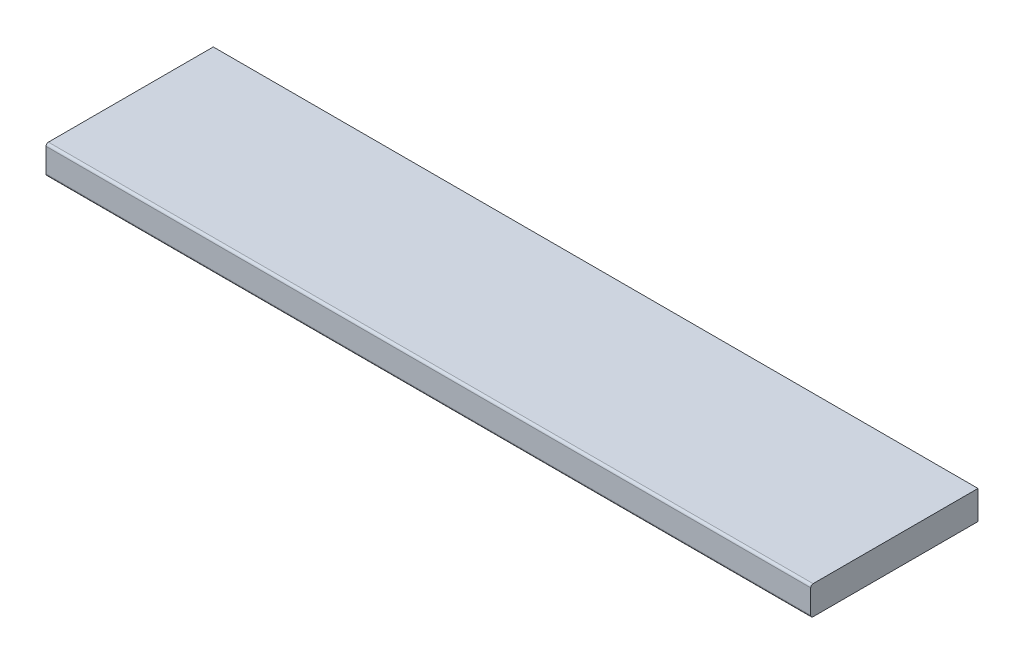
ISO-10303-21;
HEADER;
FILE_DESCRIPTION(('STEP AP214'),'2;1');
FILE_NAME('part.step','',(''),(''),'','','');
FILE_SCHEMA(('AUTOMOTIVE_DESIGN { 1 0 10303 214 1 1 1 1 }'));
ENDSEC;
DATA;
#1=APPLICATION_CONTEXT('core data for automotive mechanical design processes');
#2=APPLICATION_PROTOCOL_DEFINITION('international standard','automotive_design',2000,#1);
#3=PRODUCT_CONTEXT('',#1,'mechanical');
#4=PRODUCT('Part','Part','',(#3));
#5=PRODUCT_RELATED_PRODUCT_CATEGORY('part','',(#4));
#6=PRODUCT_DEFINITION_FORMATION('','',#4);
#7=PRODUCT_DEFINITION_CONTEXT('part definition',#1,'design');
#8=PRODUCT_DEFINITION('design','',#6,#7);
#9=PRODUCT_DEFINITION_SHAPE('','',#8);
#10=(LENGTH_UNIT() NAMED_UNIT(*) SI_UNIT(.MILLI.,.METRE.));
#11=(NAMED_UNIT(*) PLANE_ANGLE_UNIT() SI_UNIT($,.RADIAN.));
#12=(NAMED_UNIT(*) SI_UNIT($,.STERADIAN.) SOLID_ANGLE_UNIT());
#13=UNCERTAINTY_MEASURE_WITH_UNIT(LENGTH_MEASURE(1.E-05),#10,'distance_accuracy_value','');
#14=(GEOMETRIC_REPRESENTATION_CONTEXT(3) GLOBAL_UNCERTAINTY_ASSIGNED_CONTEXT((#13)) GLOBAL_UNIT_ASSIGNED_CONTEXT((#10,
#11,#12)) REPRESENTATION_CONTEXT('',''));
#15=CARTESIAN_POINT('',(0.,0.,0.));
#16=DIRECTION('',(0.,0.,1.));
#17=DIRECTION('',(1.,0.,0.));
#18=AXIS2_PLACEMENT_3D('',#15,#16,#17);
#19=CARTESIAN_POINT('',(-198.947368421053,28.7368421052632,350.));
#20=DIRECTION('',(1.,0.,0.));
#21=DIRECTION('',(0.,0.,-1.));
#22=AXIS2_PLACEMENT_3D('',#19,#20,#21);
#23=PLANE('',#22);
#24=DIRECTION('',(0.,0.,-1.));
#25=VECTOR('',#24,1.);
#26=CARTESIAN_POINT('',(-198.947368421053,-31.2631578947368,350.));
#27=LINE('',#26,#25);
#28=CARTESIAN_POINT('',(-198.947368421053,-31.2631578947368,345.));
#29=VERTEX_POINT('',#28);
#30=CARTESIAN_POINT('',(-198.947368421053,-31.2631578947368,0.));
#31=VERTEX_POINT('',#30);
#32=EDGE_CURVE('E84',#29,#31,#27,.T.);
#33=ORIENTED_EDGE('',*,*,#32,.F.);
#34=CARTESIAN_POINT('',(-198.947368421053,-26.2631578947368,345.));
#35=DIRECTION('',(1.,0.,0.));
#36=DIRECTION('',(0.,0.,-1.));
#37=AXIS2_PLACEMENT_3D('',#34,#35,#36);
#38=CIRCLE('',#37,5.);
#39=CARTESIAN_POINT('',(-198.947368421053,-26.2631578947368,350.));
#40=VERTEX_POINT('',#39);
#41=EDGE_CURVE('E41',#29,#40,#38,.F.);
#42=ORIENTED_EDGE('',*,*,#41,.T.);
#43=DIRECTION('',(0.,-1.,0.));
#44=VECTOR('',#43,1.);
#45=CARTESIAN_POINT('',(-198.947368421053,28.7368421052632,350.));
#46=LINE('',#45,#44);
#47=CARTESIAN_POINT('',(-198.947368421053,23.7368421052632,350.));
#48=VERTEX_POINT('',#47);
#49=EDGE_CURVE('E112',#48,#40,#46,.T.);
#50=ORIENTED_EDGE('',*,*,#49,.F.);
#51=CARTESIAN_POINT('',(-198.947368421053,23.7368421052632,345.));
#52=DIRECTION('',(1.,0.,0.));
#53=DIRECTION('',(0.,0.,-1.));
#54=AXIS2_PLACEMENT_3D('',#51,#52,#53);
#55=CIRCLE('',#54,5.);
#56=CARTESIAN_POINT('',(-198.947368421053,28.7368421052632,345.));
#57=VERTEX_POINT('',#56);
#58=EDGE_CURVE('E48',#48,#57,#55,.F.);
#59=ORIENTED_EDGE('',*,*,#58,.T.);
#60=DIRECTION('',(0.,0.,-1.));
#61=VECTOR('',#60,1.);
#62=CARTESIAN_POINT('',(-198.947368421053,28.7368421052632,350.));
#63=LINE('',#62,#61);
#64=CARTESIAN_POINT('',(-198.947368421053,28.7368421052632,0.));
#65=VERTEX_POINT('',#64);
#66=EDGE_CURVE('E102',#57,#65,#63,.T.);
#67=ORIENTED_EDGE('',*,*,#66,.T.);
#68=DIRECTION('',(0.,-1.,0.));
#69=VECTOR('',#68,1.);
#70=CARTESIAN_POINT('',(-198.947368421053,28.7368421052632,0.));
#71=LINE('',#70,#69);
#72=EDGE_CURVE('E98',#65,#31,#71,.T.);
#73=ORIENTED_EDGE('',*,*,#72,.T.);
#74=EDGE_LOOP('',(#33,#42,#50,#59,#67,#73));
#75=FACE_BOUND('',#74,.T.);
#76=ADVANCED_FACE('F33',(#75),#23,.F.);
#77=CARTESIAN_POINT('',(-198.947368421053,-31.2631578947368,350.));
#78=DIRECTION('',(0.,1.,0.));
#79=DIRECTION('',(0.,0.,1.));
#80=AXIS2_PLACEMENT_3D('',#77,#78,#79);
#81=PLANE('',#80);
#82=DIRECTION('',(0.,0.,-1.));
#83=VECTOR('',#82,1.);
#84=CARTESIAN_POINT('',(1401.05263157895,-31.2631578947368,350.));
#85=LINE('',#84,#83);
#86=CARTESIAN_POINT('',(1401.05263157895,-31.2631578947368,345.));
#87=VERTEX_POINT('',#86);
#88=CARTESIAN_POINT('',(1401.05263157895,-31.2631578947368,0.));
#89=VERTEX_POINT('',#88);
#90=EDGE_CURVE('E92',#87,#89,#85,.T.);
#91=ORIENTED_EDGE('',*,*,#90,.F.);
#92=DIRECTION('',(1.,0.,0.));
#93=VECTOR('',#92,1.);
#94=CARTESIAN_POINT('',(-198.947368421053,-31.2631578947368,345.));
#95=LINE('',#94,#93);
#96=EDGE_CURVE('E56',#87,#29,#95,.F.);
#97=ORIENTED_EDGE('',*,*,#96,.T.);
#98=ORIENTED_EDGE('',*,*,#32,.T.);
#99=DIRECTION('',(1.,0.,0.));
#100=VECTOR('',#99,1.);
#101=CARTESIAN_POINT('',(-198.947368421053,-31.2631578947368,0.));
#102=LINE('',#101,#100);
#103=EDGE_CURVE('E87',#31,#89,#102,.T.);
#104=ORIENTED_EDGE('',*,*,#103,.T.);
#105=EDGE_LOOP('',(#91,#97,#98,#104));
#106=FACE_BOUND('',#105,.T.);
#107=ADVANCED_FACE('F86',(#106),#81,.F.);
#108=CARTESIAN_POINT('',(1401.05263157895,28.7368421052632,350.));
#109=DIRECTION('',(-1.,0.,0.));
#110=DIRECTION('',(0.,0.,1.));
#111=AXIS2_PLACEMENT_3D('',#108,#109,#110);
#112=PLANE('',#111);
#113=DIRECTION('',(0.,1.,0.));
#114=VECTOR('',#113,1.);
#115=CARTESIAN_POINT('',(1401.05263157895,28.7368421052632,350.));
#116=LINE('',#115,#114);
#117=CARTESIAN_POINT('',(1401.05263157895,-26.2631578947368,350.));
#118=VERTEX_POINT('',#117);
#119=CARTESIAN_POINT('',(1401.05263157895,23.7368421052632,350.));
#120=VERTEX_POINT('',#119);
#121=EDGE_CURVE('E106',#118,#120,#116,.T.);
#122=ORIENTED_EDGE('',*,*,#121,.F.);
#123=CARTESIAN_POINT('',(1401.05263157895,-26.2631578947368,345.));
#124=DIRECTION('',(-1.,0.,0.));
#125=DIRECTION('',(0.,0.,1.));
#126=AXIS2_PLACEMENT_3D('',#123,#124,#125);
#127=CIRCLE('',#126,5.);
#128=EDGE_CURVE('E124',#118,#87,#127,.F.);
#129=ORIENTED_EDGE('',*,*,#128,.T.);
#130=ORIENTED_EDGE('',*,*,#90,.T.);
#131=DIRECTION('',(0.,1.,0.));
#132=VECTOR('',#131,1.);
#133=CARTESIAN_POINT('',(1401.05263157895,28.7368421052632,0.));
#134=LINE('',#133,#132);
#135=CARTESIAN_POINT('',(1401.05263157895,28.7368421052632,0.));
#136=VERTEX_POINT('',#135);
#137=EDGE_CURVE('E100',#89,#136,#134,.T.);
#138=ORIENTED_EDGE('',*,*,#137,.T.);
#139=DIRECTION('',(0.,0.,-1.));
#140=VECTOR('',#139,1.);
#141=CARTESIAN_POINT('',(1401.05263157895,28.7368421052632,350.));
#142=LINE('',#141,#140);
#143=CARTESIAN_POINT('',(1401.05263157895,28.7368421052632,345.));
#144=VERTEX_POINT('',#143);
#145=EDGE_CURVE('E114',#144,#136,#142,.T.);
#146=ORIENTED_EDGE('',*,*,#145,.F.);
#147=CARTESIAN_POINT('',(1401.05263157895,23.7368421052632,345.));
#148=DIRECTION('',(-1.,0.,0.));
#149=DIRECTION('',(0.,0.,1.));
#150=AXIS2_PLACEMENT_3D('',#147,#148,#149);
#151=CIRCLE('',#150,5.);
#152=EDGE_CURVE('E122',#144,#120,#151,.F.);
#153=ORIENTED_EDGE('',*,*,#152,.T.);
#154=EDGE_LOOP('',(#122,#129,#130,#138,#146,#153));
#155=FACE_BOUND('',#154,.T.);
#156=ADVANCED_FACE('F137',(#155),#112,.F.);
#157=CARTESIAN_POINT('',(-198.947368421053,28.7368421052632,350.));
#158=DIRECTION('',(0.,-1.,0.));
#159=DIRECTION('',(1.,0.,0.));
#160=AXIS2_PLACEMENT_3D('',#157,#158,#159);
#161=PLANE('',#160);
#162=ORIENTED_EDGE('',*,*,#66,.F.);
#163=DIRECTION('',(-1.,0.,0.));
#164=VECTOR('',#163,1.);
#165=CARTESIAN_POINT('',(1401.05263157895,28.7368421052632,345.));
#166=LINE('',#165,#164);
#167=EDGE_CURVE('E11',#57,#144,#166,.F.);
#168=ORIENTED_EDGE('',*,*,#167,.T.);
#169=ORIENTED_EDGE('',*,*,#145,.T.);
#170=DIRECTION('',(-1.,0.,0.));
#171=VECTOR('',#170,1.);
#172=CARTESIAN_POINT('',(-198.947368421053,28.7368421052632,0.));
#173=LINE('',#172,#171);
#174=EDGE_CURVE('E110',#136,#65,#173,.T.);
#175=ORIENTED_EDGE('',*,*,#174,.T.);
#176=EDGE_LOOP('',(#162,#168,#169,#175));
#177=FACE_BOUND('',#176,.T.);
#178=ADVANCED_FACE('F143',(#177),#161,.F.);
#179=CARTESIAN_POINT('',(0.,0.,350.));
#180=DIRECTION('',(0.,0.,1.));
#181=DIRECTION('',(1.,0.,0.));
#182=AXIS2_PLACEMENT_3D('',#179,#180,#181);
#183=PLANE('',#182);
#184=ORIENTED_EDGE('',*,*,#49,.T.);
#185=DIRECTION('',(1.,0.,0.));
#186=VECTOR('',#185,1.);
#187=CARTESIAN_POINT('',(1401.05263157895,-26.2631578947368,350.));
#188=LINE('',#187,#186);
#189=EDGE_CURVE('E119',#40,#118,#188,.T.);
#190=ORIENTED_EDGE('',*,*,#189,.T.);
#191=ORIENTED_EDGE('',*,*,#121,.T.);
#192=DIRECTION('',(-1.,0.,0.));
#193=VECTOR('',#192,1.);
#194=CARTESIAN_POINT('',(-198.947368421053,23.7368421052632,350.));
#195=LINE('',#194,#193);
#196=EDGE_CURVE('E91',#120,#48,#195,.T.);
#197=ORIENTED_EDGE('',*,*,#196,.T.);
#198=EDGE_LOOP('',(#184,#190,#191,#197));
#199=FACE_BOUND('',#198,.T.);
#200=ADVANCED_FACE('F131',(#199),#183,.T.);
#201=CARTESIAN_POINT('',(0.,0.,0.));
#202=DIRECTION('',(0.,0.,1.));
#203=DIRECTION('',(1.,0.,0.));
#204=AXIS2_PLACEMENT_3D('',#201,#202,#203);
#205=PLANE('',#204);
#206=ORIENTED_EDGE('',*,*,#72,.F.);
#207=ORIENTED_EDGE('',*,*,#174,.F.);
#208=ORIENTED_EDGE('',*,*,#137,.F.);
#209=ORIENTED_EDGE('',*,*,#103,.F.);
#210=EDGE_LOOP('',(#206,#207,#208,#209));
#211=FACE_BOUND('',#210,.T.);
#212=ADVANCED_FACE('F96',(#211),#205,.F.);
#213=CARTESIAN_POINT('',(0.,-26.2631578947368,345.));
#214=DIRECTION('',(-1.,0.,0.));
#215=DIRECTION('',(0.,0.,1.));
#216=AXIS2_PLACEMENT_3D('',#213,#214,#215);
#217=CYLINDRICAL_SURFACE('',#216,5.);
#218=ORIENTED_EDGE('',*,*,#41,.F.);
#219=ORIENTED_EDGE('',*,*,#96,.F.);
#220=ORIENTED_EDGE('',*,*,#128,.F.);
#221=ORIENTED_EDGE('',*,*,#189,.F.);
#222=EDGE_LOOP('',(#218,#219,#220,#221));
#223=FACE_BOUND('',#222,.T.);
#224=ADVANCED_FACE('F135',(#223),#217,.T.);
#225=CARTESIAN_POINT('',(0.,23.7368421052632,345.));
#226=DIRECTION('',(1.,0.,0.));
#227=DIRECTION('',(0.,1.,0.));
#228=AXIS2_PLACEMENT_3D('',#225,#226,#227);
#229=CYLINDRICAL_SURFACE('',#228,5.);
#230=ORIENTED_EDGE('',*,*,#152,.F.);
#231=ORIENTED_EDGE('',*,*,#167,.F.);
#232=ORIENTED_EDGE('',*,*,#58,.F.);
#233=ORIENTED_EDGE('',*,*,#196,.F.);
#234=EDGE_LOOP('',(#230,#231,#232,#233));
#235=FACE_BOUND('',#234,.T.);
#236=ADVANCED_FACE('F35',(#235),#229,.T.);
#237=CLOSED_SHELL('',(#76,#107,#156,#178,#200,#212,#224,#236));
#238=MANIFOLD_SOLID_BREP('B2',#237);
#239=ADVANCED_BREP_SHAPE_REPRESENTATION('',(#18,#238),#14);
#240=SHAPE_DEFINITION_REPRESENTATION(#9,#239);
ENDSEC;
END-ISO-10303-21;
